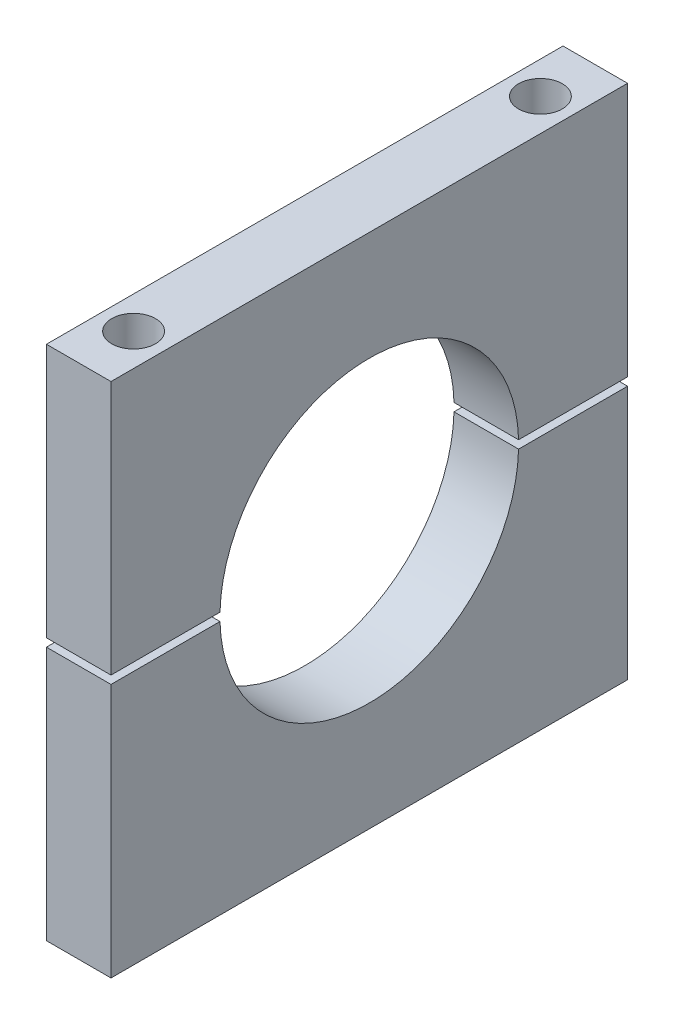
ISO-10303-21;
HEADER;
FILE_DESCRIPTION(('STEP AP214'),'2;1');
FILE_NAME('part.step','',(''),(''),'','','');
FILE_SCHEMA(('AUTOMOTIVE_DESIGN { 1 0 10303 214 1 1 1 1 }'));
ENDSEC;
DATA;
#1=APPLICATION_CONTEXT('core data for automotive mechanical design processes');
#2=APPLICATION_PROTOCOL_DEFINITION('international standard','automotive_design',2000,#1);
#3=PRODUCT_CONTEXT('',#1,'mechanical');
#4=PRODUCT('Part','Part','',(#3));
#5=PRODUCT_RELATED_PRODUCT_CATEGORY('part','',(#4));
#6=PRODUCT_DEFINITION_FORMATION('','',#4);
#7=PRODUCT_DEFINITION_CONTEXT('part definition',#1,'design');
#8=PRODUCT_DEFINITION('design','',#6,#7);
#9=PRODUCT_DEFINITION_SHAPE('','',#8);
#10=(LENGTH_UNIT() NAMED_UNIT(*) SI_UNIT(.MILLI.,.METRE.));
#11=(NAMED_UNIT(*) PLANE_ANGLE_UNIT() SI_UNIT($,.RADIAN.));
#12=(NAMED_UNIT(*) SI_UNIT($,.STERADIAN.) SOLID_ANGLE_UNIT());
#13=UNCERTAINTY_MEASURE_WITH_UNIT(LENGTH_MEASURE(1.E-05),#10,'distance_accuracy_value','');
#14=(GEOMETRIC_REPRESENTATION_CONTEXT(3) GLOBAL_UNCERTAINTY_ASSIGNED_CONTEXT((#13)) GLOBAL_UNIT_ASSIGNED_CONTEXT((#10,
#11,#12)) REPRESENTATION_CONTEXT('',''));
#15=CARTESIAN_POINT('',(0.,0.,0.));
#16=DIRECTION('',(0.,0.,1.));
#17=DIRECTION('',(1.,0.,0.));
#18=AXIS2_PLACEMENT_3D('',#15,#16,#17);
#19=CARTESIAN_POINT('',(3.175,0.,0.));
#20=DIRECTION('',(-1.,0.,0.));
#21=DIRECTION('',(0.,0.,1.));
#22=AXIS2_PLACEMENT_3D('',#19,#20,#21);
#23=CYLINDRICAL_SURFACE('',#22,14.6875);
#24=CARTESIAN_POINT('',(-3.175,0.,0.));
#25=DIRECTION('',(1.,0.,0.));
#26=DIRECTION('',(0.,0.,-1.));
#27=AXIS2_PLACEMENT_3D('',#24,#25,#26);
#28=CIRCLE('',#27,14.6875);
#29=CARTESIAN_POINT('',(-3.175,-0.396875000000011,14.6821369862965));
#30=VERTEX_POINT('',#29);
#31=CARTESIAN_POINT('',(-3.175,-0.396875000000011,-14.6821369862965));
#32=VERTEX_POINT('',#31);
#33=EDGE_CURVE('E151',#30,#32,#28,.T.);
#34=ORIENTED_EDGE('',*,*,#33,.F.);
#35=DIRECTION('',(-1.,0.,0.));
#36=VECTOR('',#35,1.);
#37=CARTESIAN_POINT('',(3.175,-0.396875000000011,14.6821369862965));
#38=LINE('',#37,#36);
#39=CARTESIAN_POINT('',(3.175,-0.396875000000011,14.6821369862965));
#40=VERTEX_POINT('',#39);
#41=EDGE_CURVE('E14',#40,#30,#38,.T.);
#42=ORIENTED_EDGE('',*,*,#41,.F.);
#43=CARTESIAN_POINT('',(3.175,0.,0.));
#44=DIRECTION('',(1.,0.,0.));
#45=DIRECTION('',(0.,0.,-1.));
#46=AXIS2_PLACEMENT_3D('',#43,#44,#45);
#47=CIRCLE('',#46,14.6875);
#48=CARTESIAN_POINT('',(3.175,-0.396875000000011,-14.6821369862965));
#49=VERTEX_POINT('',#48);
#50=EDGE_CURVE('E176',#40,#49,#47,.T.);
#51=ORIENTED_EDGE('',*,*,#50,.T.);
#52=DIRECTION('',(-1.,0.,0.));
#53=VECTOR('',#52,1.);
#54=CARTESIAN_POINT('',(3.175,-0.396875000000011,-14.6821369862965));
#55=LINE('',#54,#53);
#56=EDGE_CURVE('E85',#49,#32,#55,.T.);
#57=ORIENTED_EDGE('',*,*,#56,.T.);
#58=EDGE_LOOP('',(#34,#42,#51,#57));
#59=FACE_BOUND('',#58,.T.);
#60=ADVANCED_FACE('F69',(#59),#23,.F.);
#61=CARTESIAN_POINT('',(3.175,-0.396875000000011,0.));
#62=DIRECTION('',(0.,1.,0.));
#63=DIRECTION('',(0.,0.,1.));
#64=AXIS2_PLACEMENT_3D('',#61,#62,#63);
#65=PLANE('',#64);
#66=CARTESIAN_POINT('',(0.,-0.396875000000012,20.0025));
#67=DIRECTION('',(0.,1.,0.));
#68=DIRECTION('',(0.,0.,1.));
#69=AXIS2_PLACEMENT_3D('',#66,#67,#68);
#70=CIRCLE('',#69,1.72719999999999);
#71=CARTESIAN_POINT('',(0.,-0.396875000000012,21.7297));
#72=VERTEX_POINT('',#71);
#73=EDGE_CURVE('E184',#72,#72,#70,.T.);
#74=ORIENTED_EDGE('',*,*,#73,.F.);
#75=EDGE_LOOP('',(#74));
#76=FACE_BOUND('',#75,.T.);
#77=DIRECTION('',(0.,0.,-1.));
#78=VECTOR('',#77,1.);
#79=CARTESIAN_POINT('',(-3.175,-0.396875000000011,0.));
#80=LINE('',#79,#78);
#81=CARTESIAN_POINT('',(-3.175,-0.396875000000011,25.4));
#82=VERTEX_POINT('',#81);
#83=EDGE_CURVE('E153',#82,#30,#80,.T.);
#84=ORIENTED_EDGE('',*,*,#83,.F.);
#85=DIRECTION('',(-1.,0.,0.));
#86=VECTOR('',#85,1.);
#87=CARTESIAN_POINT('',(3.175,-0.396875000000011,25.4));
#88=LINE('',#87,#86);
#89=CARTESIAN_POINT('',(3.175,-0.396875000000011,25.4));
#90=VERTEX_POINT('',#89);
#91=EDGE_CURVE('E77',#90,#82,#88,.T.);
#92=ORIENTED_EDGE('',*,*,#91,.F.);
#93=DIRECTION('',(0.,0.,-1.));
#94=VECTOR('',#93,1.);
#95=CARTESIAN_POINT('',(3.175,-0.396875000000011,0.));
#96=LINE('',#95,#94);
#97=EDGE_CURVE('E148',#90,#40,#96,.T.);
#98=ORIENTED_EDGE('',*,*,#97,.T.);
#99=ORIENTED_EDGE('',*,*,#41,.T.);
#100=EDGE_LOOP('',(#84,#92,#98,#99));
#101=FACE_BOUND('',#100,.T.);
#102=ADVANCED_FACE('F172',(#76,#101),#65,.T.);
#103=CARTESIAN_POINT('',(3.175,0.,25.4));
#104=DIRECTION('',(0.,0.,1.));
#105=DIRECTION('',(1.,0.,0.));
#106=AXIS2_PLACEMENT_3D('',#103,#104,#105);
#107=PLANE('',#106);
#108=DIRECTION('',(0.,1.,0.));
#109=VECTOR('',#108,1.);
#110=CARTESIAN_POINT('',(-3.175,0.,25.4));
#111=LINE('',#110,#109);
#112=CARTESIAN_POINT('',(-3.175,-25.4,25.4));
#113=VERTEX_POINT('',#112);
#114=EDGE_CURVE('E157',#113,#82,#111,.T.);
#115=ORIENTED_EDGE('',*,*,#114,.F.);
#116=DIRECTION('',(-1.,0.,0.));
#117=VECTOR('',#116,1.);
#118=CARTESIAN_POINT('',(3.175,-25.4,25.4));
#119=LINE('',#118,#117);
#120=CARTESIAN_POINT('',(3.175,-25.4,25.4));
#121=VERTEX_POINT('',#120);
#122=EDGE_CURVE('E142',#121,#113,#119,.T.);
#123=ORIENTED_EDGE('',*,*,#122,.F.);
#124=DIRECTION('',(0.,1.,0.));
#125=VECTOR('',#124,1.);
#126=CARTESIAN_POINT('',(3.175,0.,25.4));
#127=LINE('',#126,#125);
#128=EDGE_CURVE('E132',#121,#90,#127,.T.);
#129=ORIENTED_EDGE('',*,*,#128,.T.);
#130=ORIENTED_EDGE('',*,*,#91,.T.);
#131=EDGE_LOOP('',(#115,#123,#129,#130));
#132=FACE_BOUND('',#131,.T.);
#133=ADVANCED_FACE('F169',(#132),#107,.T.);
#134=CARTESIAN_POINT('',(3.175,-25.4,0.));
#135=DIRECTION('',(0.,1.,0.));
#136=DIRECTION('',(0.,0.,1.));
#137=AXIS2_PLACEMENT_3D('',#134,#135,#136);
#138=PLANE('',#137);
#139=CARTESIAN_POINT('',(0.,-25.4,20.0025));
#140=DIRECTION('',(0.,1.,0.));
#141=DIRECTION('',(0.,0.,1.));
#142=AXIS2_PLACEMENT_3D('',#139,#140,#141);
#143=CIRCLE('',#142,1.72719999999999);
#144=CARTESIAN_POINT('',(0.,-25.4,21.7297));
#145=VERTEX_POINT('',#144);
#146=EDGE_CURVE('E187',#145,#145,#143,.T.);
#147=ORIENTED_EDGE('',*,*,#146,.T.);
#148=EDGE_LOOP('',(#147));
#149=FACE_BOUND('',#148,.T.);
#150=CARTESIAN_POINT('',(0.,-25.4,-20.0025));
#151=DIRECTION('',(0.,1.,0.));
#152=DIRECTION('',(0.,0.,1.));
#153=AXIS2_PLACEMENT_3D('',#150,#151,#152);
#154=CIRCLE('',#153,1.72719999999999);
#155=CARTESIAN_POINT('',(0.,-25.4,-18.2753));
#156=VERTEX_POINT('',#155);
#157=EDGE_CURVE('E181',#156,#156,#154,.T.);
#158=ORIENTED_EDGE('',*,*,#157,.T.);
#159=EDGE_LOOP('',(#158));
#160=FACE_BOUND('',#159,.T.);
#161=DIRECTION('',(0.,0.,-1.));
#162=VECTOR('',#161,1.);
#163=CARTESIAN_POINT('',(-3.175,-25.4,0.));
#164=LINE('',#163,#162);
#165=CARTESIAN_POINT('',(-3.175,-25.4,-25.4));
#166=VERTEX_POINT('',#165);
#167=EDGE_CURVE('E139',#113,#166,#164,.T.);
#168=ORIENTED_EDGE('',*,*,#167,.T.);
#169=DIRECTION('',(-1.,0.,0.));
#170=VECTOR('',#169,1.);
#171=CARTESIAN_POINT('',(3.175,-25.4,-25.4));
#172=LINE('',#171,#170);
#173=CARTESIAN_POINT('',(3.175,-25.4,-25.4));
#174=VERTEX_POINT('',#173);
#175=EDGE_CURVE('E136',#174,#166,#172,.T.);
#176=ORIENTED_EDGE('',*,*,#175,.F.);
#177=DIRECTION('',(0.,0.,-1.));
#178=VECTOR('',#177,1.);
#179=CARTESIAN_POINT('',(3.175,-25.4,0.));
#180=LINE('',#179,#178);
#181=EDGE_CURVE('E124',#121,#174,#180,.T.);
#182=ORIENTED_EDGE('',*,*,#181,.F.);
#183=ORIENTED_EDGE('',*,*,#122,.T.);
#184=EDGE_LOOP('',(#168,#176,#182,#183));
#185=FACE_BOUND('',#184,.T.);
#186=ADVANCED_FACE('F137',(#149,#160,#185),#138,.F.);
#187=CARTESIAN_POINT('',(3.175,0.,-25.4));
#188=DIRECTION('',(0.,0.,1.));
#189=DIRECTION('',(1.,0.,0.));
#190=AXIS2_PLACEMENT_3D('',#187,#188,#189);
#191=PLANE('',#190);
#192=DIRECTION('',(0.,1.,0.));
#193=VECTOR('',#192,1.);
#194=CARTESIAN_POINT('',(-3.175,0.,-25.4));
#195=LINE('',#194,#193);
#196=CARTESIAN_POINT('',(-3.175,-0.396875000000011,-25.4));
#197=VERTEX_POINT('',#196);
#198=EDGE_CURVE('E162',#166,#197,#195,.T.);
#199=ORIENTED_EDGE('',*,*,#198,.T.);
#200=DIRECTION('',(-1.,0.,0.));
#201=VECTOR('',#200,1.);
#202=CARTESIAN_POINT('',(3.175,-0.396875000000011,-25.4));
#203=LINE('',#202,#201);
#204=CARTESIAN_POINT('',(3.175,-0.396875000000011,-25.4));
#205=VERTEX_POINT('',#204);
#206=EDGE_CURVE('E105',#205,#197,#203,.T.);
#207=ORIENTED_EDGE('',*,*,#206,.F.);
#208=DIRECTION('',(0.,1.,0.));
#209=VECTOR('',#208,1.);
#210=CARTESIAN_POINT('',(3.175,0.,-25.4));
#211=LINE('',#210,#209);
#212=EDGE_CURVE('E129',#174,#205,#211,.T.);
#213=ORIENTED_EDGE('',*,*,#212,.F.);
#214=ORIENTED_EDGE('',*,*,#175,.T.);
#215=EDGE_LOOP('',(#199,#207,#213,#214));
#216=FACE_BOUND('',#215,.T.);
#217=ADVANCED_FACE('F144',(#216),#191,.F.);
#218=CARTESIAN_POINT('',(0.,-0.396875000000012,-20.0025));
#219=DIRECTION('',(0.,1.,0.));
#220=DIRECTION('',(0.,0.,1.));
#221=AXIS2_PLACEMENT_3D('',#218,#219,#220);
#222=CIRCLE('',#221,1.72719999999999);
#223=CARTESIAN_POINT('',(0.,-0.396875000000012,-18.2753));
#224=VERTEX_POINT('',#223);
#225=EDGE_CURVE('E154',#224,#224,#222,.T.);
#226=ORIENTED_EDGE('',*,*,#225,.F.);
#227=EDGE_LOOP('',(#226));
#228=FACE_BOUND('',#227,.T.);
#229=EDGE_CURVE('E158',#32,#197,#80,.T.);
#230=ORIENTED_EDGE('',*,*,#229,.F.);
#231=ORIENTED_EDGE('',*,*,#56,.F.);
#232=EDGE_CURVE('E145',#49,#205,#96,.T.);
#233=ORIENTED_EDGE('',*,*,#232,.T.);
#234=ORIENTED_EDGE('',*,*,#206,.T.);
#235=EDGE_LOOP('',(#230,#231,#233,#234));
#236=FACE_BOUND('',#235,.T.);
#237=ADVANCED_FACE('F209',(#228,#236),#65,.T.);
#238=CARTESIAN_POINT('',(3.175,0.,0.));
#239=DIRECTION('',(1.,0.,0.));
#240=DIRECTION('',(0.,0.,-1.));
#241=AXIS2_PLACEMENT_3D('',#238,#239,#240);
#242=PLANE('',#241);
#243=ORIENTED_EDGE('',*,*,#50,.F.);
#244=ORIENTED_EDGE('',*,*,#97,.F.);
#245=ORIENTED_EDGE('',*,*,#128,.F.);
#246=ORIENTED_EDGE('',*,*,#181,.T.);
#247=ORIENTED_EDGE('',*,*,#212,.T.);
#248=ORIENTED_EDGE('',*,*,#232,.F.);
#249=EDGE_LOOP('',(#243,#244,#245,#246,#247,#248));
#250=FACE_BOUND('',#249,.T.);
#251=ADVANCED_FACE('F126',(#250),#242,.T.);
#252=CARTESIAN_POINT('',(-3.175,0.,0.));
#253=DIRECTION('',(1.,0.,0.));
#254=DIRECTION('',(0.,0.,-1.));
#255=AXIS2_PLACEMENT_3D('',#252,#253,#254);
#256=PLANE('',#255);
#257=ORIENTED_EDGE('',*,*,#33,.T.);
#258=ORIENTED_EDGE('',*,*,#229,.T.);
#259=ORIENTED_EDGE('',*,*,#198,.F.);
#260=ORIENTED_EDGE('',*,*,#167,.F.);
#261=ORIENTED_EDGE('',*,*,#114,.T.);
#262=ORIENTED_EDGE('',*,*,#83,.T.);
#263=EDGE_LOOP('',(#257,#258,#259,#260,#261,#262));
#264=FACE_BOUND('',#263,.T.);
#265=ADVANCED_FACE('F174',(#264),#256,.F.);
#266=CARTESIAN_POINT('',(0.,25.4,-20.0025));
#267=DIRECTION('',(0.,1.,0.));
#268=DIRECTION('',(0.,0.,1.));
#269=AXIS2_PLACEMENT_3D('',#266,#267,#268);
#270=CYLINDRICAL_SURFACE('',#269,1.72719999999999);
#271=ORIENTED_EDGE('',*,*,#225,.T.);
#272=EDGE_LOOP('',(#271));
#273=FACE_BOUND('',#272,.T.);
#274=ORIENTED_EDGE('',*,*,#157,.F.);
#275=EDGE_LOOP('',(#274));
#276=FACE_BOUND('',#275,.T.);
#277=ADVANCED_FACE('F195',(#273,#276),#270,.F.);
#278=CARTESIAN_POINT('',(0.,25.4,20.0025));
#279=DIRECTION('',(0.,1.,0.));
#280=DIRECTION('',(0.,0.,1.));
#281=AXIS2_PLACEMENT_3D('',#278,#279,#280);
#282=CYLINDRICAL_SURFACE('',#281,1.72719999999999);
#283=ORIENTED_EDGE('',*,*,#73,.T.);
#284=EDGE_LOOP('',(#283));
#285=FACE_BOUND('',#284,.T.);
#286=ORIENTED_EDGE('',*,*,#146,.F.);
#287=EDGE_LOOP('',(#286));
#288=FACE_BOUND('',#287,.T.);
#289=ADVANCED_FACE('F193',(#285,#288),#282,.F.);
#290=CLOSED_SHELL('',(#60,#102,#133,#186,#217,#237,#251,#265,#277,#289));
#291=MANIFOLD_SOLID_BREP('B2',#290);
#292=CARTESIAN_POINT('',(3.175,0.,0.));
#293=DIRECTION('',(-1.,0.,0.));
#294=DIRECTION('',(0.,0.,1.));
#295=AXIS2_PLACEMENT_3D('',#292,#293,#294);
#296=CYLINDRICAL_SURFACE('',#295,14.6875);
#297=CARTESIAN_POINT('',(-3.175,0.,0.));
#298=DIRECTION('',(1.,0.,0.));
#299=DIRECTION('',(0.,0.,-1.));
#300=AXIS2_PLACEMENT_3D('',#297,#298,#299);
#301=CIRCLE('',#300,14.6875);
#302=CARTESIAN_POINT('',(-3.175,0.396874999999988,-14.6821369862965));
#303=VERTEX_POINT('',#302);
#304=CARTESIAN_POINT('',(-3.175,0.396874999999988,14.6821369862965));
#305=VERTEX_POINT('',#304);
#306=EDGE_CURVE('E374',#303,#305,#301,.T.);
#307=ORIENTED_EDGE('',*,*,#306,.F.);
#308=DIRECTION('',(-1.,0.,0.));
#309=VECTOR('',#308,1.);
#310=CARTESIAN_POINT('',(3.175,0.396874999999988,-14.6821369862965));
#311=LINE('',#310,#309);
#312=CARTESIAN_POINT('',(3.175,0.396874999999988,-14.6821369862965));
#313=VERTEX_POINT('',#312);
#314=EDGE_CURVE('E67',#313,#303,#311,.T.);
#315=ORIENTED_EDGE('',*,*,#314,.F.);
#316=CARTESIAN_POINT('',(3.175,0.,0.));
#317=DIRECTION('',(1.,0.,0.));
#318=DIRECTION('',(0.,0.,-1.));
#319=AXIS2_PLACEMENT_3D('',#316,#317,#318);
#320=CIRCLE('',#319,14.6875);
#321=CARTESIAN_POINT('',(3.175,0.396874999999988,14.6821369862965));
#322=VERTEX_POINT('',#321);
#323=EDGE_CURVE('E398',#313,#322,#320,.T.);
#324=ORIENTED_EDGE('',*,*,#323,.T.);
#325=DIRECTION('',(-1.,0.,0.));
#326=VECTOR('',#325,1.);
#327=CARTESIAN_POINT('',(3.175,0.396874999999988,14.6821369862965));
#328=LINE('',#327,#326);
#329=EDGE_CURVE('E336',#322,#305,#328,.T.);
#330=ORIENTED_EDGE('',*,*,#329,.T.);
#331=EDGE_LOOP('',(#307,#315,#324,#330));
#332=FACE_BOUND('',#331,.T.);
#333=ADVANCED_FACE('F292',(#332),#296,.F.);
#334=CARTESIAN_POINT('',(3.175,0.396874999999988,0.));
#335=DIRECTION('',(0.,1.,0.));
#336=DIRECTION('',(0.,0.,1.));
#337=AXIS2_PLACEMENT_3D('',#334,#335,#336);
#338=PLANE('',#337);
#339=CARTESIAN_POINT('',(0.,0.396874999999988,-20.0025));
#340=DIRECTION('',(0.,1.,0.));
#341=DIRECTION('',(0.,0.,1.));
#342=AXIS2_PLACEMENT_3D('',#339,#340,#341);
#343=CIRCLE('',#342,2.15265);
#344=CARTESIAN_POINT('',(0.,0.396874999999988,-17.84985));
#345=VERTEX_POINT('',#344);
#346=EDGE_CURVE('E378',#345,#345,#343,.T.);
#347=ORIENTED_EDGE('',*,*,#346,.T.);
#348=EDGE_LOOP('',(#347));
#349=FACE_BOUND('',#348,.T.);
#350=DIRECTION('',(0.,0.,-1.));
#351=VECTOR('',#350,1.);
#352=CARTESIAN_POINT('',(-3.175,0.396874999999988,0.));
#353=LINE('',#352,#351);
#354=CARTESIAN_POINT('',(-3.175,0.396874999999988,-25.4));
#355=VERTEX_POINT('',#354);
#356=EDGE_CURVE('E377',#303,#355,#353,.T.);
#357=ORIENTED_EDGE('',*,*,#356,.T.);
#358=DIRECTION('',(-1.,0.,0.));
#359=VECTOR('',#358,1.);
#360=CARTESIAN_POINT('',(3.175,0.396874999999988,-25.4));
#361=LINE('',#360,#359);
#362=CARTESIAN_POINT('',(3.175,0.396874999999988,-25.4));
#363=VERTEX_POINT('',#362);
#364=EDGE_CURVE('E300',#363,#355,#361,.T.);
#365=ORIENTED_EDGE('',*,*,#364,.F.);
#366=DIRECTION('',(0.,0.,-1.));
#367=VECTOR('',#366,1.);
#368=CARTESIAN_POINT('',(3.175,0.396874999999988,0.));
#369=LINE('',#368,#367);
#370=EDGE_CURVE('E371',#313,#363,#369,.T.);
#371=ORIENTED_EDGE('',*,*,#370,.F.);
#372=ORIENTED_EDGE('',*,*,#314,.T.);
#373=EDGE_LOOP('',(#357,#365,#371,#372));
#374=FACE_BOUND('',#373,.T.);
#375=ADVANCED_FACE('F434',(#349,#374),#338,.F.);
#376=CARTESIAN_POINT('',(3.175,0.,-25.4));
#377=DIRECTION('',(0.,0.,1.));
#378=DIRECTION('',(1.,0.,0.));
#379=AXIS2_PLACEMENT_3D('',#376,#377,#378);
#380=PLANE('',#379);
#381=DIRECTION('',(0.,1.,0.));
#382=VECTOR('',#381,1.);
#383=CARTESIAN_POINT('',(-3.175,0.,-25.4));
#384=LINE('',#383,#382);
#385=CARTESIAN_POINT('',(-3.175,25.4,-25.4));
#386=VERTEX_POINT('',#385);
#387=EDGE_CURVE('E380',#355,#386,#384,.T.);
#388=ORIENTED_EDGE('',*,*,#387,.T.);
#389=DIRECTION('',(-1.,0.,0.));
#390=VECTOR('',#389,1.);
#391=CARTESIAN_POINT('',(3.175,25.4,-25.4));
#392=LINE('',#391,#390);
#393=CARTESIAN_POINT('',(3.175,25.4,-25.4));
#394=VERTEX_POINT('',#393);
#395=EDGE_CURVE('E360',#394,#386,#392,.T.);
#396=ORIENTED_EDGE('',*,*,#395,.F.);
#397=DIRECTION('',(0.,1.,0.));
#398=VECTOR('',#397,1.);
#399=CARTESIAN_POINT('',(3.175,0.,-25.4));
#400=LINE('',#399,#398);
#401=EDGE_CURVE('E365',#363,#394,#400,.T.);
#402=ORIENTED_EDGE('',*,*,#401,.F.);
#403=ORIENTED_EDGE('',*,*,#364,.T.);
#404=EDGE_LOOP('',(#388,#396,#402,#403));
#405=FACE_BOUND('',#404,.T.);
#406=ADVANCED_FACE('F393',(#405),#380,.F.);
#407=CARTESIAN_POINT('',(3.175,25.4,0.));
#408=DIRECTION('',(0.,1.,0.));
#409=DIRECTION('',(0.,0.,1.));
#410=AXIS2_PLACEMENT_3D('',#407,#408,#409);
#411=PLANE('',#410);
#412=CARTESIAN_POINT('',(0.,25.4,20.0025));
#413=DIRECTION('',(0.,1.,0.));
#414=DIRECTION('',(0.,0.,1.));
#415=AXIS2_PLACEMENT_3D('',#412,#413,#414);
#416=CIRCLE('',#415,2.15265);
#417=CARTESIAN_POINT('',(0.,25.4,22.15515));
#418=VERTEX_POINT('',#417);
#419=EDGE_CURVE('E409',#418,#418,#416,.T.);
#420=ORIENTED_EDGE('',*,*,#419,.F.);
#421=EDGE_LOOP('',(#420));
#422=FACE_BOUND('',#421,.T.);
#423=CARTESIAN_POINT('',(0.,25.4,-20.0025));
#424=DIRECTION('',(0.,1.,0.));
#425=DIRECTION('',(0.,0.,1.));
#426=AXIS2_PLACEMENT_3D('',#423,#424,#425);
#427=CIRCLE('',#426,2.15265);
#428=CARTESIAN_POINT('',(0.,25.4,-17.84985));
#429=VERTEX_POINT('',#428);
#430=EDGE_CURVE('E403',#429,#429,#427,.T.);
#431=ORIENTED_EDGE('',*,*,#430,.F.);
#432=EDGE_LOOP('',(#431));
#433=FACE_BOUND('',#432,.T.);
#434=DIRECTION('',(0.,0.,-1.));
#435=VECTOR('',#434,1.);
#436=CARTESIAN_POINT('',(-3.175,25.4,0.));
#437=LINE('',#436,#435);
#438=CARTESIAN_POINT('',(-3.175,25.4,25.4));
#439=VERTEX_POINT('',#438);
#440=EDGE_CURVE('E355',#439,#386,#437,.T.);
#441=ORIENTED_EDGE('',*,*,#440,.F.);
#442=DIRECTION('',(-1.,0.,0.));
#443=VECTOR('',#442,1.);
#444=CARTESIAN_POINT('',(3.175,25.4,25.4));
#445=LINE('',#444,#443);
#446=CARTESIAN_POINT('',(3.175,25.4,25.4));
#447=VERTEX_POINT('',#446);
#448=EDGE_CURVE('E350',#447,#439,#445,.T.);
#449=ORIENTED_EDGE('',*,*,#448,.F.);
#450=DIRECTION('',(0.,0.,-1.));
#451=VECTOR('',#450,1.);
#452=CARTESIAN_POINT('',(3.175,25.4,0.));
#453=LINE('',#452,#451);
#454=EDGE_CURVE('E353',#447,#394,#453,.T.);
#455=ORIENTED_EDGE('',*,*,#454,.T.);
#456=ORIENTED_EDGE('',*,*,#395,.T.);
#457=EDGE_LOOP('',(#441,#449,#455,#456));
#458=FACE_BOUND('',#457,.T.);
#459=ADVANCED_FACE('F352',(#422,#433,#458),#411,.T.);
#460=CARTESIAN_POINT('',(3.175,0.,25.4));
#461=DIRECTION('',(0.,0.,1.));
#462=DIRECTION('',(1.,0.,0.));
#463=AXIS2_PLACEMENT_3D('',#460,#461,#462);
#464=PLANE('',#463);
#465=DIRECTION('',(0.,1.,0.));
#466=VECTOR('',#465,1.);
#467=CARTESIAN_POINT('',(-3.175,0.,25.4));
#468=LINE('',#467,#466);
#469=CARTESIAN_POINT('',(-3.175,0.396874999999988,25.4));
#470=VERTEX_POINT('',#469);
#471=EDGE_CURVE('E385',#470,#439,#468,.T.);
#472=ORIENTED_EDGE('',*,*,#471,.F.);
#473=DIRECTION('',(-1.,0.,0.));
#474=VECTOR('',#473,1.);
#475=CARTESIAN_POINT('',(3.175,0.396874999999988,25.4));
#476=LINE('',#475,#474);
#477=CARTESIAN_POINT('',(3.175,0.396874999999988,25.4));
#478=VERTEX_POINT('',#477);
#479=EDGE_CURVE('E329',#478,#470,#476,.T.);
#480=ORIENTED_EDGE('',*,*,#479,.F.);
#481=DIRECTION('',(0.,1.,0.));
#482=VECTOR('',#481,1.);
#483=CARTESIAN_POINT('',(3.175,0.,25.4));
#484=LINE('',#483,#482);
#485=EDGE_CURVE('E363',#478,#447,#484,.T.);
#486=ORIENTED_EDGE('',*,*,#485,.T.);
#487=ORIENTED_EDGE('',*,*,#448,.T.);
#488=EDGE_LOOP('',(#472,#480,#486,#487));
#489=FACE_BOUND('',#488,.T.);
#490=ADVANCED_FACE('F368',(#489),#464,.T.);
#491=CARTESIAN_POINT('',(0.,0.396874999999988,20.0025));
#492=DIRECTION('',(0.,1.,0.));
#493=DIRECTION('',(0.,0.,1.));
#494=AXIS2_PLACEMENT_3D('',#491,#492,#493);
#495=CIRCLE('',#494,2.15265);
#496=CARTESIAN_POINT('',(0.,0.396874999999988,22.15515));
#497=VERTEX_POINT('',#496);
#498=EDGE_CURVE('E406',#497,#497,#495,.T.);
#499=ORIENTED_EDGE('',*,*,#498,.T.);
#500=EDGE_LOOP('',(#499));
#501=FACE_BOUND('',#500,.T.);
#502=EDGE_CURVE('E381',#470,#305,#353,.T.);
#503=ORIENTED_EDGE('',*,*,#502,.T.);
#504=ORIENTED_EDGE('',*,*,#329,.F.);
#505=EDGE_CURVE('E308',#478,#322,#369,.T.);
#506=ORIENTED_EDGE('',*,*,#505,.F.);
#507=ORIENTED_EDGE('',*,*,#479,.T.);
#508=EDGE_LOOP('',(#503,#504,#506,#507));
#509=FACE_BOUND('',#508,.T.);
#510=ADVANCED_FACE('F440',(#501,#509),#338,.F.);
#511=CARTESIAN_POINT('',(3.175,0.,0.));
#512=DIRECTION('',(1.,0.,0.));
#513=DIRECTION('',(0.,0.,-1.));
#514=AXIS2_PLACEMENT_3D('',#511,#512,#513);
#515=PLANE('',#514);
#516=ORIENTED_EDGE('',*,*,#323,.F.);
#517=ORIENTED_EDGE('',*,*,#370,.T.);
#518=ORIENTED_EDGE('',*,*,#401,.T.);
#519=ORIENTED_EDGE('',*,*,#454,.F.);
#520=ORIENTED_EDGE('',*,*,#485,.F.);
#521=ORIENTED_EDGE('',*,*,#505,.T.);
#522=EDGE_LOOP('',(#516,#517,#518,#519,#520,#521));
#523=FACE_BOUND('',#522,.T.);
#524=ADVANCED_FACE('F362',(#523),#515,.T.);
#525=CARTESIAN_POINT('',(-3.175,0.,0.));
#526=DIRECTION('',(1.,0.,0.));
#527=DIRECTION('',(0.,0.,-1.));
#528=AXIS2_PLACEMENT_3D('',#525,#526,#527);
#529=PLANE('',#528);
#530=ORIENTED_EDGE('',*,*,#306,.T.);
#531=ORIENTED_EDGE('',*,*,#502,.F.);
#532=ORIENTED_EDGE('',*,*,#471,.T.);
#533=ORIENTED_EDGE('',*,*,#440,.T.);
#534=ORIENTED_EDGE('',*,*,#387,.F.);
#535=ORIENTED_EDGE('',*,*,#356,.F.);
#536=EDGE_LOOP('',(#530,#531,#532,#533,#534,#535));
#537=FACE_BOUND('',#536,.T.);
#538=ADVANCED_FACE('F397',(#537),#529,.F.);
#539=CARTESIAN_POINT('',(0.,25.4,-20.0025));
#540=DIRECTION('',(0.,1.,0.));
#541=DIRECTION('',(0.,0.,1.));
#542=AXIS2_PLACEMENT_3D('',#539,#540,#541);
#543=CYLINDRICAL_SURFACE('',#542,2.15265);
#544=ORIENTED_EDGE('',*,*,#346,.F.);
#545=EDGE_LOOP('',(#544));
#546=FACE_BOUND('',#545,.T.);
#547=ORIENTED_EDGE('',*,*,#430,.T.);
#548=EDGE_LOOP('',(#547));
#549=FACE_BOUND('',#548,.T.);
#550=ADVANCED_FACE('F420',(#546,#549),#543,.F.);
#551=CARTESIAN_POINT('',(0.,25.4,20.0025));
#552=DIRECTION('',(0.,1.,0.));
#553=DIRECTION('',(0.,0.,1.));
#554=AXIS2_PLACEMENT_3D('',#551,#552,#553);
#555=CYLINDRICAL_SURFACE('',#554,2.15265);
#556=ORIENTED_EDGE('',*,*,#498,.F.);
#557=EDGE_LOOP('',(#556));
#558=FACE_BOUND('',#557,.T.);
#559=ORIENTED_EDGE('',*,*,#419,.T.);
#560=EDGE_LOOP('',(#559));
#561=FACE_BOUND('',#560,.T.);
#562=ADVANCED_FACE('F413',(#558,#561),#555,.F.);
#563=CLOSED_SHELL('',(#333,#375,#406,#459,#490,#510,#524,#538,#550,#562));
#564=MANIFOLD_SOLID_BREP('B8',#563);
#565=ADVANCED_BREP_SHAPE_REPRESENTATION('',(#18,#291,#564),#14);
#566=SHAPE_DEFINITION_REPRESENTATION(#9,#565);
ENDSEC;
END-ISO-10303-21;
